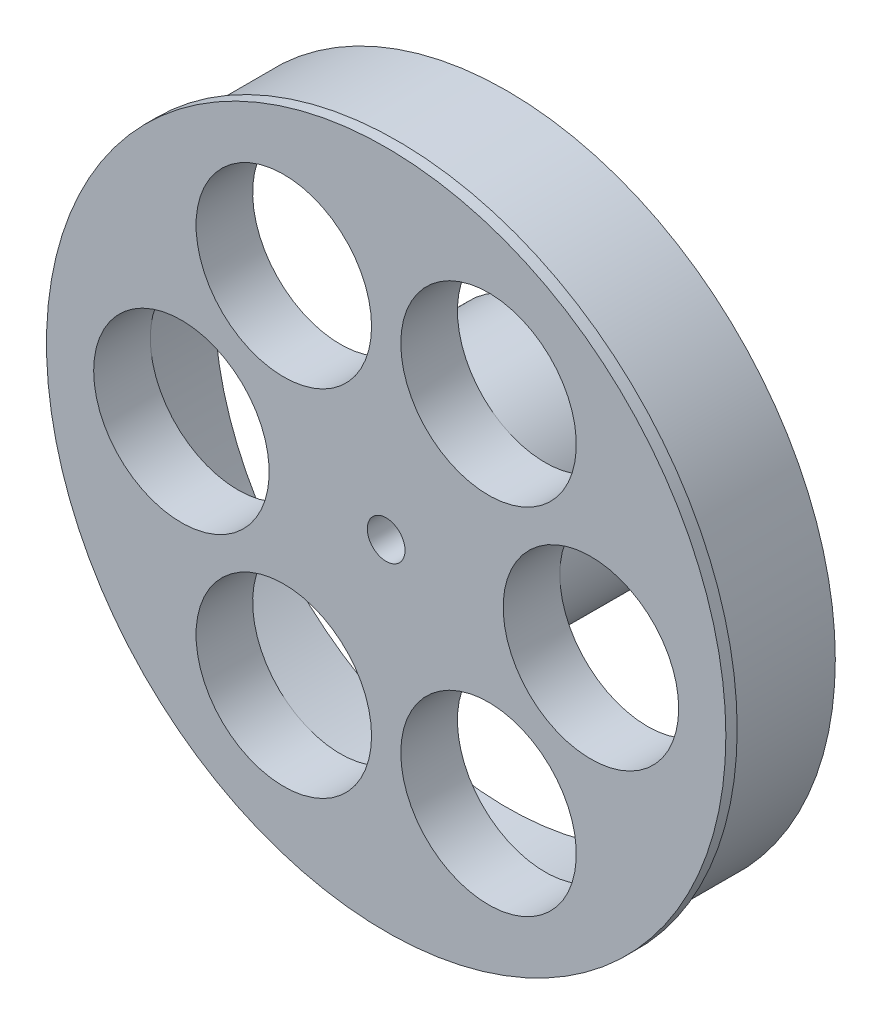
ISO-10303-21;
HEADER;
FILE_DESCRIPTION(('STEP AP214'),'2;1');
FILE_NAME('part.step','',(''),(''),'','','');
FILE_SCHEMA(('AUTOMOTIVE_DESIGN { 1 0 10303 214 1 1 1 1 }'));
ENDSEC;
DATA;
#1=APPLICATION_CONTEXT('core data for automotive mechanical design processes');
#2=APPLICATION_PROTOCOL_DEFINITION('international standard','automotive_design',2000,#1);
#3=PRODUCT_CONTEXT('',#1,'mechanical');
#4=PRODUCT('Part','Part','',(#3));
#5=PRODUCT_RELATED_PRODUCT_CATEGORY('part','',(#4));
#6=PRODUCT_DEFINITION_FORMATION('','',#4);
#7=PRODUCT_DEFINITION_CONTEXT('part definition',#1,'design');
#8=PRODUCT_DEFINITION('design','',#6,#7);
#9=PRODUCT_DEFINITION_SHAPE('','',#8);
#10=(LENGTH_UNIT() NAMED_UNIT(*) SI_UNIT(.MILLI.,.METRE.));
#11=(NAMED_UNIT(*) PLANE_ANGLE_UNIT() SI_UNIT($,.RADIAN.));
#12=(NAMED_UNIT(*) SI_UNIT($,.STERADIAN.) SOLID_ANGLE_UNIT());
#13=UNCERTAINTY_MEASURE_WITH_UNIT(LENGTH_MEASURE(1.E-05),#10,'distance_accuracy_value','');
#14=(GEOMETRIC_REPRESENTATION_CONTEXT(3) GLOBAL_UNCERTAINTY_ASSIGNED_CONTEXT((#13)) GLOBAL_UNIT_ASSIGNED_CONTEXT((#10,
#11,#12)) REPRESENTATION_CONTEXT('',''));
#15=CARTESIAN_POINT('',(0.,0.,0.));
#16=DIRECTION('',(0.,0.,1.));
#17=DIRECTION('',(1.,0.,0.));
#18=AXIS2_PLACEMENT_3D('',#15,#16,#17);
#19=CARTESIAN_POINT('',(0.,7.75,-1.5));
#20=DIRECTION('',(0.,0.,1.));
#21=DIRECTION('',(1.,0.,0.));
#22=AXIS2_PLACEMENT_3D('',#19,#20,#21);
#23=PLANE('',#22);
#24=CARTESIAN_POINT('',(0.,0.,-1.5));
#25=DIRECTION('',(0.,0.,1.));
#26=DIRECTION('',(1.,0.,0.));
#27=AXIS2_PLACEMENT_3D('',#24,#25,#26);
#28=CIRCLE('',#27,7.75);
#29=CARTESIAN_POINT('',(3.87500000000008,6.71169687932935,-1.5));
#30=VERTEX_POINT('',#29);
#31=CARTESIAN_POINT('',(-3.87499999999994,6.71169687932944,-1.5));
#32=VERTEX_POINT('',#31);
#33=EDGE_CURVE('E122',#30,#32,#28,.T.);
#34=ORIENTED_EDGE('',*,*,#33,.F.);
#35=CARTESIAN_POINT('',(2.71250000000005,4.69818781553055,-1.5));
#36=DIRECTION('',(0.,0.,1.));
#37=DIRECTION('',(1.,0.,0.));
#38=AXIS2_PLACEMENT_3D('',#35,#36,#37);
#39=CIRCLE('',#38,2.325);
#40=CARTESIAN_POINT('',(1.55000000000003,2.68467875173174,-1.5));
#41=VERTEX_POINT('',#40);
#42=EDGE_CURVE('E56',#41,#30,#39,.F.);
#43=ORIENTED_EDGE('',*,*,#42,.F.);
#44=CARTESIAN_POINT('',(0.,0.,-1.5));
#45=DIRECTION('',(0.,0.,1.));
#46=DIRECTION('',(1.,0.,0.));
#47=AXIS2_PLACEMENT_3D('',#44,#45,#46);
#48=CIRCLE('',#47,3.1);
#49=CARTESIAN_POINT('',(-1.54999999999997,2.68467875173177,-1.5));
#50=VERTEX_POINT('',#49);
#51=EDGE_CURVE('E274',#41,#50,#48,.T.);
#52=ORIENTED_EDGE('',*,*,#51,.T.);
#53=CARTESIAN_POINT('',(-2.71249999999996,4.69818781553061,-1.5));
#54=DIRECTION('',(0.,0.,1.));
#55=DIRECTION('',(1.,0.,0.));
#56=AXIS2_PLACEMENT_3D('',#53,#54,#55);
#57=CIRCLE('',#56,2.325);
#58=EDGE_CURVE('E235',#32,#50,#57,.F.);
#59=ORIENTED_EDGE('',*,*,#58,.F.);
#60=EDGE_LOOP('',(#34,#43,#52,#59));
#61=FACE_BOUND('',#60,.T.);
#62=ADVANCED_FACE('F35',(#61),#23,.F.);
#63=CARTESIAN_POINT('',(-7.75,0.,-1.5));
#64=VERTEX_POINT('',#63);
#65=EDGE_CURVE('E121',#32,#64,#28,.T.);
#66=ORIENTED_EDGE('',*,*,#65,.F.);
#67=EDGE_CURVE('E49',#50,#32,#57,.F.);
#68=ORIENTED_EDGE('',*,*,#67,.F.);
#69=CARTESIAN_POINT('',(-3.1,0.,-1.5));
#70=VERTEX_POINT('',#69);
#71=EDGE_CURVE('E279',#50,#70,#48,.T.);
#72=ORIENTED_EDGE('',*,*,#71,.T.);
#73=CARTESIAN_POINT('',(-5.425,0.,-1.5));
#74=DIRECTION('',(0.,0.,1.));
#75=DIRECTION('',(1.,0.,0.));
#76=AXIS2_PLACEMENT_3D('',#73,#74,#75);
#77=CIRCLE('',#76,2.325);
#78=EDGE_CURVE('E226',#64,#70,#77,.F.);
#79=ORIENTED_EDGE('',*,*,#78,.F.);
#80=EDGE_LOOP('',(#66,#68,#72,#79));
#81=FACE_BOUND('',#80,.T.);
#82=ADVANCED_FACE('F169',(#81),#23,.F.);
#83=CARTESIAN_POINT('',(3.1,0.,-1.5));
#84=VERTEX_POINT('',#83);
#85=EDGE_CURVE('E127',#84,#41,#48,.T.);
#86=ORIENTED_EDGE('',*,*,#85,.T.);
#87=EDGE_CURVE('E240',#30,#41,#39,.F.);
#88=ORIENTED_EDGE('',*,*,#87,.F.);
#89=CARTESIAN_POINT('',(7.75,0.,-1.5));
#90=VERTEX_POINT('',#89);
#91=EDGE_CURVE('E123',#90,#30,#28,.T.);
#92=ORIENTED_EDGE('',*,*,#91,.F.);
#93=CARTESIAN_POINT('',(5.425,0.,-1.5));
#94=DIRECTION('',(0.,0.,1.));
#95=DIRECTION('',(1.,0.,0.));
#96=AXIS2_PLACEMENT_3D('',#93,#94,#95);
#97=CIRCLE('',#96,2.325);
#98=EDGE_CURVE('E249',#84,#90,#97,.F.);
#99=ORIENTED_EDGE('',*,*,#98,.F.);
#100=EDGE_LOOP('',(#86,#88,#92,#99));
#101=FACE_BOUND('',#100,.T.);
#102=ADVANCED_FACE('F174',(#101),#23,.F.);
#103=CARTESIAN_POINT('',(-3.87500000000003,-6.71169687932938,-1.5));
#104=VERTEX_POINT('',#103);
#105=EDGE_CURVE('E103',#64,#104,#28,.T.);
#106=ORIENTED_EDGE('',*,*,#105,.F.);
#107=EDGE_CURVE('E224',#70,#64,#77,.F.);
#108=ORIENTED_EDGE('',*,*,#107,.F.);
#109=CARTESIAN_POINT('',(-1.55000000000001,-2.68467875173175,-1.5));
#110=VERTEX_POINT('',#109);
#111=EDGE_CURVE('E106',#70,#110,#48,.T.);
#112=ORIENTED_EDGE('',*,*,#111,.T.);
#113=CARTESIAN_POINT('',(-2.71250000000002,-4.69818781553057,-1.5));
#114=DIRECTION('',(0.,0.,1.));
#115=DIRECTION('',(1.,0.,0.));
#116=AXIS2_PLACEMENT_3D('',#113,#114,#115);
#117=CIRCLE('',#116,2.325);
#118=EDGE_CURVE('E90',#104,#110,#117,.F.);
#119=ORIENTED_EDGE('',*,*,#118,.F.);
#120=EDGE_LOOP('',(#106,#108,#112,#119));
#121=FACE_BOUND('',#120,.T.);
#122=ADVANCED_FACE('F100',(#121),#23,.F.);
#123=CARTESIAN_POINT('',(3.87499999999998,-6.71169687932941,-1.5));
#124=VERTEX_POINT('',#123);
#125=EDGE_CURVE('E110',#104,#124,#28,.T.);
#126=ORIENTED_EDGE('',*,*,#125,.F.);
#127=EDGE_CURVE('E87',#110,#104,#117,.F.);
#128=ORIENTED_EDGE('',*,*,#127,.F.);
#129=CARTESIAN_POINT('',(1.54999999999999,-2.68467875173176,-1.5));
#130=VERTEX_POINT('',#129);
#131=EDGE_CURVE('E269',#110,#130,#48,.T.);
#132=ORIENTED_EDGE('',*,*,#131,.T.);
#133=CARTESIAN_POINT('',(2.71249999999999,-4.69818781553059,-1.5));
#134=DIRECTION('',(0.,0.,1.));
#135=DIRECTION('',(1.,0.,0.));
#136=AXIS2_PLACEMENT_3D('',#133,#134,#135);
#137=CIRCLE('',#136,2.325);
#138=EDGE_CURVE('E112',#124,#130,#137,.F.);
#139=ORIENTED_EDGE('',*,*,#138,.F.);
#140=EDGE_LOOP('',(#126,#128,#132,#139));
#141=FACE_BOUND('',#140,.T.);
#142=ADVANCED_FACE('F111',(#141),#23,.F.);
#143=CARTESIAN_POINT('',(0.,0.5,0.));
#144=DIRECTION('',(0.,0.,-1.));
#145=DIRECTION('',(-1.,0.,0.));
#146=AXIS2_PLACEMENT_3D('',#143,#144,#145);
#147=PLANE('',#146);
#148=CARTESIAN_POINT('',(2.71250000000005,4.69818781553055,0.));
#149=DIRECTION('',(0.,0.,1.));
#150=DIRECTION('',(0.50000000000001,0.866025403784433,0.));
#151=AXIS2_PLACEMENT_3D('',#148,#149,#150);
#152=CIRCLE('',#151,2.325);
#153=CARTESIAN_POINT('',(3.87500000000008,6.71169687932935,0.));
#154=VERTEX_POINT('',#153);
#155=EDGE_CURVE('E237',#154,#154,#152,.T.);
#156=ORIENTED_EDGE('',*,*,#155,.F.);
#157=EDGE_LOOP('',(#156));
#158=FACE_BOUND('',#157,.T.);
#159=CARTESIAN_POINT('',(-2.71249999999996,4.69818781553061,0.));
#160=DIRECTION('',(0.,0.,1.));
#161=DIRECTION('',(-0.499999999999992,0.866025403784443,0.));
#162=AXIS2_PLACEMENT_3D('',#159,#160,#161);
#163=CIRCLE('',#162,2.325);
#164=CARTESIAN_POINT('',(-3.87499999999994,6.71169687932943,0.));
#165=VERTEX_POINT('',#164);
#166=EDGE_CURVE('E232',#165,#165,#163,.T.);
#167=ORIENTED_EDGE('',*,*,#166,.F.);
#168=EDGE_LOOP('',(#167));
#169=FACE_BOUND('',#168,.T.);
#170=CARTESIAN_POINT('',(-5.425,0.,0.));
#171=DIRECTION('',(0.,0.,1.));
#172=DIRECTION('',(-1.,0.,0.));
#173=AXIS2_PLACEMENT_3D('',#170,#171,#172);
#174=CIRCLE('',#173,2.325);
#175=CARTESIAN_POINT('',(-7.75,0.,0.));
#176=VERTEX_POINT('',#175);
#177=EDGE_CURVE('E229',#176,#176,#174,.T.);
#178=ORIENTED_EDGE('',*,*,#177,.F.);
#179=EDGE_LOOP('',(#178));
#180=FACE_BOUND('',#179,.T.);
#181=CARTESIAN_POINT('',(-2.71250000000002,-4.69818781553057,0.));
#182=DIRECTION('',(0.,0.,1.));
#183=DIRECTION('',(-0.500000000000004,-0.866025403784436,0.));
#184=AXIS2_PLACEMENT_3D('',#181,#182,#183);
#185=CIRCLE('',#184,2.325);
#186=CARTESIAN_POINT('',(-3.87500000000003,-6.71169687932938,0.));
#187=VERTEX_POINT('',#186);
#188=EDGE_CURVE('E95',#187,#187,#185,.T.);
#189=ORIENTED_EDGE('',*,*,#188,.F.);
#190=EDGE_LOOP('',(#189));
#191=FACE_BOUND('',#190,.T.);
#192=CARTESIAN_POINT('',(2.71249999999999,-4.69818781553059,0.));
#193=DIRECTION('',(0.,0.,1.));
#194=DIRECTION('',(0.499999999999998,-0.86602540378444,0.));
#195=AXIS2_PLACEMENT_3D('',#192,#193,#194);
#196=CIRCLE('',#195,2.325);
#197=CARTESIAN_POINT('',(3.87499999999998,-6.71169687932941,0.));
#198=VERTEX_POINT('',#197);
#199=EDGE_CURVE('E107',#198,#198,#196,.T.);
#200=ORIENTED_EDGE('',*,*,#199,.F.);
#201=EDGE_LOOP('',(#200));
#202=FACE_BOUND('',#201,.T.);
#203=CARTESIAN_POINT('',(5.425,0.,0.));
#204=DIRECTION('',(0.,0.,1.));
#205=DIRECTION('',(1.,0.,0.));
#206=AXIS2_PLACEMENT_3D('',#203,#204,#205);
#207=CIRCLE('',#206,2.325);
#208=CARTESIAN_POINT('',(7.75,0.,0.));
#209=VERTEX_POINT('',#208);
#210=EDGE_CURVE('E246',#209,#209,#207,.T.);
#211=ORIENTED_EDGE('',*,*,#210,.F.);
#212=EDGE_LOOP('',(#211));
#213=FACE_BOUND('',#212,.T.);
#214=CARTESIAN_POINT('',(0.,0.,0.));
#215=DIRECTION('',(0.,0.,1.));
#216=DIRECTION('',(1.,0.,0.));
#217=AXIS2_PLACEMENT_3D('',#214,#215,#216);
#218=CIRCLE('',#217,0.5);
#219=CARTESIAN_POINT('',(0.5,0.,0.));
#220=VERTEX_POINT('',#219);
#221=EDGE_CURVE('E253',#220,#220,#218,.T.);
#222=ORIENTED_EDGE('',*,*,#221,.F.);
#223=EDGE_LOOP('',(#222));
#224=FACE_BOUND('',#223,.T.);
#225=CARTESIAN_POINT('',(0.,0.,0.));
#226=DIRECTION('',(0.,0.,1.));
#227=DIRECTION('',(1.,0.,0.));
#228=AXIS2_PLACEMENT_3D('',#225,#226,#227);
#229=CIRCLE('',#228,9.);
#230=CARTESIAN_POINT('',(9.,0.,0.));
#231=VERTEX_POINT('',#230);
#232=EDGE_CURVE('E11',#231,#231,#229,.T.);
#233=ORIENTED_EDGE('',*,*,#232,.T.);
#234=EDGE_LOOP('',(#233));
#235=FACE_BOUND('',#234,.T.);
#236=ADVANCED_FACE('F37',(#158,#169,#180,#191,#202,#213,#224,#235),#147,.F.);
#237=CARTESIAN_POINT('',(0.,0.,59.8380004578011));
#238=DIRECTION('',(0.,0.,1.));
#239=DIRECTION('',(1.,0.,0.));
#240=AXIS2_PLACEMENT_3D('',#237,#238,#239);
#241=CYLINDRICAL_SURFACE('',#240,9.);
#242=ORIENTED_EDGE('',*,*,#232,.F.);
#243=EDGE_LOOP('',(#242));
#244=FACE_BOUND('',#243,.T.);
#245=CARTESIAN_POINT('',(0.,0.,-0.300000000000002));
#246=DIRECTION('',(0.,0.,1.));
#247=DIRECTION('',(1.,0.,0.));
#248=AXIS2_PLACEMENT_3D('',#245,#246,#247);
#249=CIRCLE('',#248,9.);
#250=CARTESIAN_POINT('',(9.,0.,-0.300000000000002));
#251=VERTEX_POINT('',#250);
#252=EDGE_CURVE('E43',#251,#251,#249,.T.);
#253=ORIENTED_EDGE('',*,*,#252,.T.);
#254=EDGE_LOOP('',(#253));
#255=FACE_BOUND('',#254,.T.);
#256=ADVANCED_FACE('F139',(#244,#255),#241,.T.);
#257=CARTESIAN_POINT('',(0.,8.7,-0.3));
#258=DIRECTION('',(0.,0.,1.));
#259=DIRECTION('',(1.,0.,0.));
#260=AXIS2_PLACEMENT_3D('',#257,#258,#259);
#261=PLANE('',#260);
#262=ORIENTED_EDGE('',*,*,#252,.F.);
#263=EDGE_LOOP('',(#262));
#264=FACE_BOUND('',#263,.T.);
#265=CARTESIAN_POINT('',(0.,0.,-0.300000000000002));
#266=DIRECTION('',(0.,0.,1.));
#267=DIRECTION('',(1.,0.,0.));
#268=AXIS2_PLACEMENT_3D('',#265,#266,#267);
#269=CIRCLE('',#268,8.7);
#270=CARTESIAN_POINT('',(8.7,0.,-0.300000000000002));
#271=VERTEX_POINT('',#270);
#272=EDGE_CURVE('E134',#271,#271,#269,.T.);
#273=ORIENTED_EDGE('',*,*,#272,.T.);
#274=EDGE_LOOP('',(#273));
#275=FACE_BOUND('',#274,.T.);
#276=ADVANCED_FACE('F141',(#264,#275),#261,.F.);
#277=CARTESIAN_POINT('',(0.,0.,59.8380004578011));
#278=DIRECTION('',(0.,0.,1.));
#279=DIRECTION('',(1.,0.,0.));
#280=AXIS2_PLACEMENT_3D('',#277,#278,#279);
#281=CYLINDRICAL_SURFACE('',#280,8.7);
#282=ORIENTED_EDGE('',*,*,#272,.F.);
#283=EDGE_LOOP('',(#282));
#284=FACE_BOUND('',#283,.T.);
#285=CARTESIAN_POINT('',(0.,0.,-3.2));
#286=DIRECTION('',(0.,0.,1.));
#287=DIRECTION('',(1.,0.,0.));
#288=AXIS2_PLACEMENT_3D('',#285,#286,#287);
#289=CIRCLE('',#288,8.7);
#290=CARTESIAN_POINT('',(8.7,0.,-3.2));
#291=VERTEX_POINT('',#290);
#292=EDGE_CURVE('E131',#291,#291,#289,.T.);
#293=ORIENTED_EDGE('',*,*,#292,.T.);
#294=EDGE_LOOP('',(#293));
#295=FACE_BOUND('',#294,.T.);
#296=ADVANCED_FACE('F144',(#284,#295),#281,.T.);
#297=CARTESIAN_POINT('',(0.,8.7,-3.2));
#298=DIRECTION('',(0.,0.,1.));
#299=DIRECTION('',(1.,0.,0.));
#300=AXIS2_PLACEMENT_3D('',#297,#298,#299);
#301=PLANE('',#300);
#302=ORIENTED_EDGE('',*,*,#292,.F.);
#303=EDGE_LOOP('',(#302));
#304=FACE_BOUND('',#303,.T.);
#305=CARTESIAN_POINT('',(0.,0.,-3.2));
#306=DIRECTION('',(0.,0.,1.));
#307=DIRECTION('',(1.,0.,0.));
#308=AXIS2_PLACEMENT_3D('',#305,#306,#307);
#309=CIRCLE('',#308,7.75);
#310=CARTESIAN_POINT('',(7.75,0.,-3.2));
#311=VERTEX_POINT('',#310);
#312=EDGE_CURVE('E126',#311,#311,#309,.T.);
#313=ORIENTED_EDGE('',*,*,#312,.T.);
#314=EDGE_LOOP('',(#313));
#315=FACE_BOUND('',#314,.T.);
#316=ADVANCED_FACE('F150',(#304,#315),#301,.F.);
#317=CARTESIAN_POINT('',(0.,0.,59.8380004578011));
#318=DIRECTION('',(0.,0.,1.));
#319=DIRECTION('',(1.,0.,0.));
#320=AXIS2_PLACEMENT_3D('',#317,#318,#319);
#321=CYLINDRICAL_SURFACE('',#320,7.75);
#322=ORIENTED_EDGE('',*,*,#312,.F.);
#323=EDGE_LOOP('',(#322));
#324=FACE_BOUND('',#323,.T.);
#325=ORIENTED_EDGE('',*,*,#91,.T.);
#326=ORIENTED_EDGE('',*,*,#33,.T.);
#327=ORIENTED_EDGE('',*,*,#65,.T.);
#328=ORIENTED_EDGE('',*,*,#105,.T.);
#329=ORIENTED_EDGE('',*,*,#125,.T.);
#330=EDGE_CURVE('E115',#124,#90,#28,.T.);
#331=ORIENTED_EDGE('',*,*,#330,.T.);
#332=EDGE_LOOP('',(#325,#326,#327,#328,#329,#331));
#333=FACE_BOUND('',#332,.T.);
#334=ADVANCED_FACE('F118',(#324,#333),#321,.F.);
#335=ORIENTED_EDGE('',*,*,#330,.F.);
#336=EDGE_CURVE('E244',#130,#124,#137,.F.);
#337=ORIENTED_EDGE('',*,*,#336,.F.);
#338=EDGE_CURVE('E266',#130,#84,#48,.T.);
#339=ORIENTED_EDGE('',*,*,#338,.T.);
#340=EDGE_CURVE('E250',#90,#84,#97,.F.);
#341=ORIENTED_EDGE('',*,*,#340,.F.);
#342=EDGE_LOOP('',(#335,#337,#339,#341));
#343=FACE_BOUND('',#342,.T.);
#344=ADVANCED_FACE('F160',(#343),#23,.F.);
#345=CARTESIAN_POINT('',(0.,0.,59.8380004578011));
#346=DIRECTION('',(0.,0.,1.));
#347=DIRECTION('',(1.,0.,0.));
#348=AXIS2_PLACEMENT_3D('',#345,#346,#347);
#349=CYLINDRICAL_SURFACE('',#348,3.1);
#350=ORIENTED_EDGE('',*,*,#85,.F.);
#351=ORIENTED_EDGE('',*,*,#338,.F.);
#352=ORIENTED_EDGE('',*,*,#131,.F.);
#353=ORIENTED_EDGE('',*,*,#111,.F.);
#354=ORIENTED_EDGE('',*,*,#71,.F.);
#355=ORIENTED_EDGE('',*,*,#51,.F.);
#356=EDGE_LOOP('',(#350,#351,#352,#353,#354,#355));
#357=FACE_BOUND('',#356,.T.);
#358=CARTESIAN_POINT('',(0.,0.,-4.40000000000001));
#359=DIRECTION('',(0.,0.,1.));
#360=DIRECTION('',(1.,0.,0.));
#361=AXIS2_PLACEMENT_3D('',#358,#359,#360);
#362=CIRCLE('',#361,3.1);
#363=CARTESIAN_POINT('',(3.1,0.,-4.40000000000001));
#364=VERTEX_POINT('',#363);
#365=EDGE_CURVE('E264',#364,#364,#362,.T.);
#366=ORIENTED_EDGE('',*,*,#365,.T.);
#367=EDGE_LOOP('',(#366));
#368=FACE_BOUND('',#367,.T.);
#369=ADVANCED_FACE('F165',(#357,#368),#349,.T.);
#370=CARTESIAN_POINT('',(0.,3.1,-4.4));
#371=DIRECTION('',(0.,0.,1.));
#372=DIRECTION('',(1.,0.,0.));
#373=AXIS2_PLACEMENT_3D('',#370,#371,#372);
#374=PLANE('',#373);
#375=ORIENTED_EDGE('',*,*,#365,.F.);
#376=EDGE_LOOP('',(#375));
#377=FACE_BOUND('',#376,.T.);
#378=CARTESIAN_POINT('',(0.,0.,-4.39999999999999));
#379=DIRECTION('',(0.,0.,1.));
#380=DIRECTION('',(1.,0.,0.));
#381=AXIS2_PLACEMENT_3D('',#378,#379,#380);
#382=CIRCLE('',#381,2.1);
#383=CARTESIAN_POINT('',(2.1,0.,-4.39999999999999));
#384=VERTEX_POINT('',#383);
#385=EDGE_CURVE('E262',#384,#384,#382,.T.);
#386=ORIENTED_EDGE('',*,*,#385,.T.);
#387=EDGE_LOOP('',(#386));
#388=FACE_BOUND('',#387,.T.);
#389=ADVANCED_FACE('F180',(#377,#388),#374,.F.);
#390=CARTESIAN_POINT('',(0.,0.,59.8380004578011));
#391=DIRECTION('',(0.,0.,1.));
#392=DIRECTION('',(1.,0.,0.));
#393=AXIS2_PLACEMENT_3D('',#390,#391,#392);
#394=CYLINDRICAL_SURFACE('',#393,2.1);
#395=ORIENTED_EDGE('',*,*,#385,.F.);
#396=EDGE_LOOP('',(#395));
#397=FACE_BOUND('',#396,.T.);
#398=CARTESIAN_POINT('',(0.,0.,-2.3));
#399=DIRECTION('',(0.,0.,1.));
#400=DIRECTION('',(1.,0.,0.));
#401=AXIS2_PLACEMENT_3D('',#398,#399,#400);
#402=CIRCLE('',#401,2.1);
#403=CARTESIAN_POINT('',(2.1,0.,-2.3));
#404=VERTEX_POINT('',#403);
#405=EDGE_CURVE('E259',#404,#404,#402,.T.);
#406=ORIENTED_EDGE('',*,*,#405,.T.);
#407=EDGE_LOOP('',(#406));
#408=FACE_BOUND('',#407,.T.);
#409=ADVANCED_FACE('F184',(#397,#408),#394,.F.);
#410=CARTESIAN_POINT('',(0.,2.1,-2.3));
#411=DIRECTION('',(0.,0.,1.));
#412=DIRECTION('',(1.,0.,0.));
#413=AXIS2_PLACEMENT_3D('',#410,#411,#412);
#414=PLANE('',#413);
#415=ORIENTED_EDGE('',*,*,#405,.F.);
#416=EDGE_LOOP('',(#415));
#417=FACE_BOUND('',#416,.T.);
#418=CARTESIAN_POINT('',(0.,0.,-2.3));
#419=DIRECTION('',(0.,0.,1.));
#420=DIRECTION('',(1.,0.,0.));
#421=AXIS2_PLACEMENT_3D('',#418,#419,#420);
#422=CIRCLE('',#421,0.5);
#423=CARTESIAN_POINT('',(0.5,0.,-2.3));
#424=VERTEX_POINT('',#423);
#425=EDGE_CURVE('E256',#424,#424,#422,.T.);
#426=ORIENTED_EDGE('',*,*,#425,.T.);
#427=EDGE_LOOP('',(#426));
#428=FACE_BOUND('',#427,.T.);
#429=ADVANCED_FACE('F188',(#417,#428),#414,.F.);
#430=CARTESIAN_POINT('',(0.,0.,59.8380004578011));
#431=DIRECTION('',(0.,0.,1.));
#432=DIRECTION('',(1.,0.,0.));
#433=AXIS2_PLACEMENT_3D('',#430,#431,#432);
#434=CYLINDRICAL_SURFACE('',#433,0.5);
#435=ORIENTED_EDGE('',*,*,#425,.F.);
#436=EDGE_LOOP('',(#435));
#437=FACE_BOUND('',#436,.T.);
#438=ORIENTED_EDGE('',*,*,#221,.T.);
#439=EDGE_LOOP('',(#438));
#440=FACE_BOUND('',#439,.T.);
#441=ADVANCED_FACE('F192',(#437,#440),#434,.F.);
#442=CARTESIAN_POINT('',(5.425,0.,-4.40100000000001));
#443=DIRECTION('',(0.,0.,1.));
#444=DIRECTION('',(1.,0.,0.));
#445=AXIS2_PLACEMENT_3D('',#442,#443,#444);
#446=CYLINDRICAL_SURFACE('',#445,2.325);
#447=ORIENTED_EDGE('',*,*,#210,.T.);
#448=EDGE_LOOP('',(#447));
#449=FACE_BOUND('',#448,.T.);
#450=ORIENTED_EDGE('',*,*,#340,.T.);
#451=ORIENTED_EDGE('',*,*,#98,.T.);
#452=EDGE_LOOP('',(#450,#451));
#453=FACE_BOUND('',#452,.T.);
#454=ADVANCED_FACE('F196',(#449,#453),#446,.F.);
#455=CARTESIAN_POINT('',(2.71249999999999,-4.69818781553059,-4.40100000000001));
#456=DIRECTION('',(0.,0.,1.));
#457=DIRECTION('',(1.,0.,0.));
#458=AXIS2_PLACEMENT_3D('',#455,#456,#457);
#459=CYLINDRICAL_SURFACE('',#458,2.325);
#460=ORIENTED_EDGE('',*,*,#199,.T.);
#461=EDGE_LOOP('',(#460));
#462=FACE_BOUND('',#461,.T.);
#463=ORIENTED_EDGE('',*,*,#138,.T.);
#464=ORIENTED_EDGE('',*,*,#336,.T.);
#465=EDGE_LOOP('',(#463,#464));
#466=FACE_BOUND('',#465,.T.);
#467=ADVANCED_FACE('F200',(#462,#466),#459,.F.);
#468=CARTESIAN_POINT('',(-2.71250000000002,-4.69818781553057,-4.40100000000001));
#469=DIRECTION('',(0.,0.,1.));
#470=DIRECTION('',(1.,0.,0.));
#471=AXIS2_PLACEMENT_3D('',#468,#469,#470);
#472=CYLINDRICAL_SURFACE('',#471,2.325);
#473=ORIENTED_EDGE('',*,*,#188,.T.);
#474=EDGE_LOOP('',(#473));
#475=FACE_BOUND('',#474,.T.);
#476=ORIENTED_EDGE('',*,*,#118,.T.);
#477=ORIENTED_EDGE('',*,*,#127,.T.);
#478=EDGE_LOOP('',(#476,#477));
#479=FACE_BOUND('',#478,.T.);
#480=ADVANCED_FACE('F89',(#475,#479),#472,.F.);
#481=CARTESIAN_POINT('',(-5.425,0.,-4.40100000000001));
#482=DIRECTION('',(0.,0.,1.));
#483=DIRECTION('',(1.,0.,0.));
#484=AXIS2_PLACEMENT_3D('',#481,#482,#483);
#485=CYLINDRICAL_SURFACE('',#484,2.325);
#486=ORIENTED_EDGE('',*,*,#177,.T.);
#487=EDGE_LOOP('',(#486));
#488=FACE_BOUND('',#487,.T.);
#489=ORIENTED_EDGE('',*,*,#107,.T.);
#490=ORIENTED_EDGE('',*,*,#78,.T.);
#491=EDGE_LOOP('',(#489,#490));
#492=FACE_BOUND('',#491,.T.);
#493=ADVANCED_FACE('F212',(#488,#492),#485,.F.);
#494=CARTESIAN_POINT('',(-2.71249999999996,4.69818781553061,-4.40100000000001));
#495=DIRECTION('',(0.,0.,1.));
#496=DIRECTION('',(1.,0.,0.));
#497=AXIS2_PLACEMENT_3D('',#494,#495,#496);
#498=CYLINDRICAL_SURFACE('',#497,2.325);
#499=ORIENTED_EDGE('',*,*,#166,.T.);
#500=EDGE_LOOP('',(#499));
#501=FACE_BOUND('',#500,.T.);
#502=ORIENTED_EDGE('',*,*,#67,.T.);
#503=ORIENTED_EDGE('',*,*,#58,.T.);
#504=EDGE_LOOP('',(#502,#503));
#505=FACE_BOUND('',#504,.T.);
#506=ADVANCED_FACE('F208',(#501,#505),#498,.F.);
#507=CARTESIAN_POINT('',(2.71250000000005,4.69818781553055,-4.40100000000001));
#508=DIRECTION('',(0.,0.,1.));
#509=DIRECTION('',(1.,0.,0.));
#510=AXIS2_PLACEMENT_3D('',#507,#508,#509);
#511=CYLINDRICAL_SURFACE('',#510,2.325);
#512=ORIENTED_EDGE('',*,*,#155,.T.);
#513=EDGE_LOOP('',(#512));
#514=FACE_BOUND('',#513,.T.);
#515=ORIENTED_EDGE('',*,*,#42,.T.);
#516=ORIENTED_EDGE('',*,*,#87,.T.);
#517=EDGE_LOOP('',(#515,#516));
#518=FACE_BOUND('',#517,.T.);
#519=ADVANCED_FACE('F205',(#514,#518),#511,.F.);
#520=CLOSED_SHELL('',(#62,#82,#102,#122,#142,#236,#256,#276,#296,#316,#334,#344,#369,#389,#409,
#429,#441,#454,#467,#480,#493,#506,#519));
#521=MANIFOLD_SOLID_BREP('B2',#520);
#522=ADVANCED_BREP_SHAPE_REPRESENTATION('',(#18,#521),#14);
#523=SHAPE_DEFINITION_REPRESENTATION(#9,#522);
ENDSEC;
END-ISO-10303-21;
